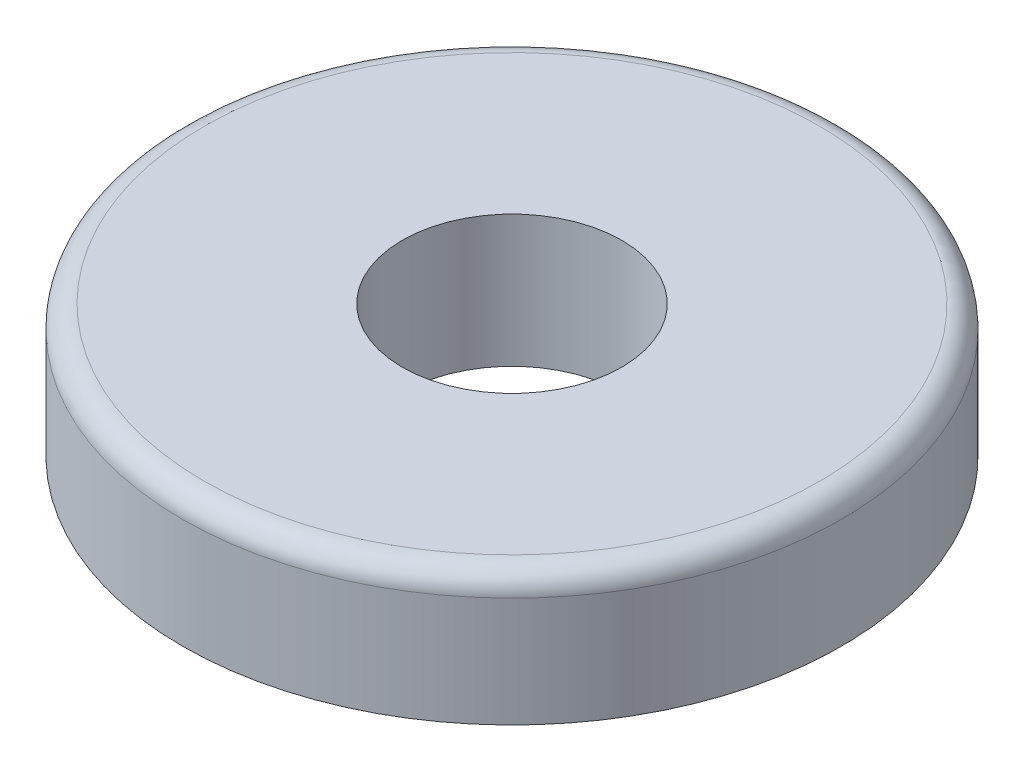
ISO-10303-21;
HEADER;
FILE_DESCRIPTION(('STEP AP214'),'2;1');
FILE_NAME('part.step','',(''),(''),'','','');
FILE_SCHEMA(('AUTOMOTIVE_DESIGN { 1 0 10303 214 1 1 1 1 }'));
ENDSEC;
DATA;
#1=APPLICATION_CONTEXT('core data for automotive mechanical design processes');
#2=APPLICATION_PROTOCOL_DEFINITION('international standard','automotive_design',2000,#1);
#3=PRODUCT_CONTEXT('',#1,'mechanical');
#4=PRODUCT('Part','Part','',(#3));
#5=PRODUCT_RELATED_PRODUCT_CATEGORY('part','',(#4));
#6=PRODUCT_DEFINITION_FORMATION('','',#4);
#7=PRODUCT_DEFINITION_CONTEXT('part definition',#1,'design');
#8=PRODUCT_DEFINITION('design','',#6,#7);
#9=PRODUCT_DEFINITION_SHAPE('','',#8);
#10=(LENGTH_UNIT() NAMED_UNIT(*) SI_UNIT(.MILLI.,.METRE.));
#11=(NAMED_UNIT(*) PLANE_ANGLE_UNIT() SI_UNIT($,.RADIAN.));
#12=(NAMED_UNIT(*) SI_UNIT($,.STERADIAN.) SOLID_ANGLE_UNIT());
#13=UNCERTAINTY_MEASURE_WITH_UNIT(LENGTH_MEASURE(1.E-05),#10,'distance_accuracy_value','');
#14=(GEOMETRIC_REPRESENTATION_CONTEXT(3) GLOBAL_UNCERTAINTY_ASSIGNED_CONTEXT((#13)) GLOBAL_UNIT_ASSIGNED_CONTEXT((#10,
#11,#12)) REPRESENTATION_CONTEXT('',''));
#15=CARTESIAN_POINT('',(0.,0.,0.));
#16=DIRECTION('',(0.,0.,1.));
#17=DIRECTION('',(1.,0.,0.));
#18=AXIS2_PLACEMENT_3D('',#15,#16,#17);
#19=CARTESIAN_POINT('',(0.,1.5,0.));
#20=DIRECTION('',(0.,1.,0.));
#21=DIRECTION('',(0.,0.,1.));
#22=AXIS2_PLACEMENT_3D('',#19,#20,#21);
#23=PLANE('',#22);
#24=CARTESIAN_POINT('',(0.,1.5,0.));
#25=DIRECTION('',(0.,1.,0.));
#26=DIRECTION('',(0.,0.,1.));
#27=AXIS2_PLACEMENT_3D('',#24,#25,#26);
#28=CIRCLE('',#27,3.5);
#29=CARTESIAN_POINT('',(0.,1.5,3.5));
#30=VERTEX_POINT('',#29);
#31=EDGE_CURVE('E45',#30,#30,#28,.T.);
#32=ORIENTED_EDGE('',*,*,#31,.T.);
#33=EDGE_LOOP('',(#32));
#34=FACE_BOUND('',#33,.T.);
#35=CARTESIAN_POINT('',(0.,1.5,0.));
#36=DIRECTION('',(0.,1.,0.));
#37=DIRECTION('',(0.,0.,1.));
#38=AXIS2_PLACEMENT_3D('',#35,#36,#37);
#39=CIRCLE('',#38,1.25);
#40=CARTESIAN_POINT('',(0.,1.5,1.25));
#41=VERTEX_POINT('',#40);
#42=EDGE_CURVE('E55',#41,#41,#39,.T.);
#43=ORIENTED_EDGE('',*,*,#42,.F.);
#44=EDGE_LOOP('',(#43));
#45=FACE_BOUND('',#44,.T.);
#46=ADVANCED_FACE('F37',(#34,#45),#23,.T.);
#47=CARTESIAN_POINT('',(0.,0.,0.));
#48=DIRECTION('',(0.,1.,0.));
#49=DIRECTION('',(0.,0.,1.));
#50=AXIS2_PLACEMENT_3D('',#47,#48,#49);
#51=PLANE('',#50);
#52=CARTESIAN_POINT('',(0.,0.,0.));
#53=DIRECTION('',(0.,1.,0.));
#54=DIRECTION('',(0.,0.,1.));
#55=AXIS2_PLACEMENT_3D('',#52,#53,#54);
#56=CIRCLE('',#55,3.75);
#57=CARTESIAN_POINT('',(0.,0.,3.75));
#58=VERTEX_POINT('',#57);
#59=EDGE_CURVE('E50',#58,#58,#56,.T.);
#60=ORIENTED_EDGE('',*,*,#59,.F.);
#61=EDGE_LOOP('',(#60));
#62=FACE_BOUND('',#61,.T.);
#63=CARTESIAN_POINT('',(0.,0.,0.));
#64=DIRECTION('',(0.,1.,0.));
#65=DIRECTION('',(0.,0.,1.));
#66=AXIS2_PLACEMENT_3D('',#63,#64,#65);
#67=CIRCLE('',#66,1.25);
#68=CARTESIAN_POINT('',(0.,0.,1.25));
#69=VERTEX_POINT('',#68);
#70=EDGE_CURVE('E58',#69,#69,#67,.T.);
#71=ORIENTED_EDGE('',*,*,#70,.T.);
#72=EDGE_LOOP('',(#71));
#73=FACE_BOUND('',#72,.T.);
#74=ADVANCED_FACE('F70',(#62,#73),#51,.F.);
#75=CARTESIAN_POINT('',(0.,1.5,0.));
#76=DIRECTION('',(0.,-1.,0.));
#77=DIRECTION('',(0.,0.,-1.));
#78=AXIS2_PLACEMENT_3D('',#75,#76,#77);
#79=CYLINDRICAL_SURFACE('',#78,3.75);
#80=CARTESIAN_POINT('',(0.,1.25,0.));
#81=DIRECTION('',(0.,1.,0.));
#82=DIRECTION('',(0.,0.,1.));
#83=AXIS2_PLACEMENT_3D('',#80,#81,#82);
#84=CIRCLE('',#83,3.75);
#85=CARTESIAN_POINT('',(0.,1.25,3.75));
#86=VERTEX_POINT('',#85);
#87=EDGE_CURVE('E10',#86,#86,#84,.F.);
#88=ORIENTED_EDGE('',*,*,#87,.T.);
#89=EDGE_LOOP('',(#88));
#90=FACE_BOUND('',#89,.T.);
#91=ORIENTED_EDGE('',*,*,#59,.T.);
#92=EDGE_LOOP('',(#91));
#93=FACE_BOUND('',#92,.T.);
#94=ADVANCED_FACE('F75',(#90,#93),#79,.T.);
#95=CARTESIAN_POINT('',(0.,1.5,0.));
#96=DIRECTION('',(0.,-1.,0.));
#97=DIRECTION('',(0.,0.,-1.));
#98=AXIS2_PLACEMENT_3D('',#95,#96,#97);
#99=CYLINDRICAL_SURFACE('',#98,1.25);
#100=ORIENTED_EDGE('',*,*,#42,.T.);
#101=EDGE_LOOP('',(#100));
#102=FACE_BOUND('',#101,.T.);
#103=ORIENTED_EDGE('',*,*,#70,.F.);
#104=EDGE_LOOP('',(#103));
#105=FACE_BOUND('',#104,.T.);
#106=ADVANCED_FACE('F66',(#102,#105),#99,.F.);
#107=CARTESIAN_POINT('',(0.,1.25,0.));
#108=DIRECTION('',(0.,1.,0.));
#109=DIRECTION('',(0.,0.,1.));
#110=AXIS2_PLACEMENT_3D('',#107,#108,#109);
#111=TOROIDAL_SURFACE('',#110,3.5,0.25);
#112=ORIENTED_EDGE('',*,*,#87,.F.);
#113=EDGE_LOOP('',(#112));
#114=FACE_BOUND('',#113,.T.);
#115=ORIENTED_EDGE('',*,*,#31,.F.);
#116=EDGE_LOOP('',(#115));
#117=FACE_BOUND('',#116,.T.);
#118=ADVANCED_FACE('F39',(#114,#117),#111,.T.);
#119=CLOSED_SHELL('',(#46,#74,#94,#106,#118));
#120=MANIFOLD_SOLID_BREP('B2',#119);
#121=ADVANCED_BREP_SHAPE_REPRESENTATION('',(#18,#120),#14);
#122=SHAPE_DEFINITION_REPRESENTATION(#9,#121);
ENDSEC;
END-ISO-10303-21;
